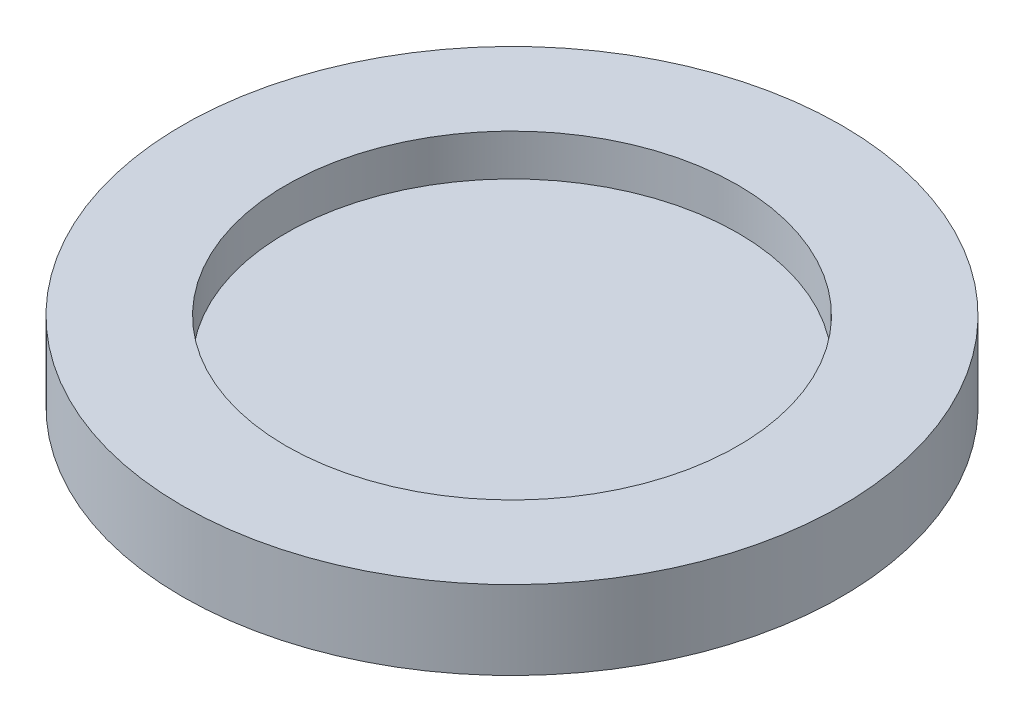
ISO-10303-21;
HEADER;
FILE_DESCRIPTION(('STEP AP214'),'2;1');
FILE_NAME('part.step','',(''),(''),'','','');
FILE_SCHEMA(('AUTOMOTIVE_DESIGN { 1 0 10303 214 1 1 1 1 }'));
ENDSEC;
DATA;
#1=APPLICATION_CONTEXT('core data for automotive mechanical design processes');
#2=APPLICATION_PROTOCOL_DEFINITION('international standard','automotive_design',2000,#1);
#3=PRODUCT_CONTEXT('',#1,'mechanical');
#4=PRODUCT('Part','Part','',(#3));
#5=PRODUCT_RELATED_PRODUCT_CATEGORY('part','',(#4));
#6=PRODUCT_DEFINITION_FORMATION('','',#4);
#7=PRODUCT_DEFINITION_CONTEXT('part definition',#1,'design');
#8=PRODUCT_DEFINITION('design','',#6,#7);
#9=PRODUCT_DEFINITION_SHAPE('','',#8);
#10=(LENGTH_UNIT() NAMED_UNIT(*) SI_UNIT(.MILLI.,.METRE.));
#11=(NAMED_UNIT(*) PLANE_ANGLE_UNIT() SI_UNIT($,.RADIAN.));
#12=(NAMED_UNIT(*) SI_UNIT($,.STERADIAN.) SOLID_ANGLE_UNIT());
#13=UNCERTAINTY_MEASURE_WITH_UNIT(LENGTH_MEASURE(1.E-05),#10,'distance_accuracy_value','');
#14=(GEOMETRIC_REPRESENTATION_CONTEXT(3) GLOBAL_UNCERTAINTY_ASSIGNED_CONTEXT((#13)) GLOBAL_UNIT_ASSIGNED_CONTEXT((#10,
#11,#12)) REPRESENTATION_CONTEXT('',''));
#15=CARTESIAN_POINT('',(0.,0.,0.));
#16=DIRECTION('',(0.,0.,1.));
#17=DIRECTION('',(1.,0.,0.));
#18=AXIS2_PLACEMENT_3D('',#15,#16,#17);
#19=CARTESIAN_POINT('',(0.,1.9,0.));
#20=DIRECTION('',(0.,1.,0.));
#21=DIRECTION('',(0.,0.,1.));
#22=AXIS2_PLACEMENT_3D('',#19,#20,#21);
#23=PLANE('',#22);
#24=CARTESIAN_POINT('',(0.,1.9,0.));
#25=DIRECTION('',(0.,1.,0.));
#26=DIRECTION('',(0.,0.,1.));
#27=AXIS2_PLACEMENT_3D('',#24,#25,#26);
#28=CIRCLE('',#27,7.95);
#29=CARTESIAN_POINT('',(0.,1.9,-7.95));
#30=VERTEX_POINT('',#29);
#31=EDGE_CURVE('E45',#30,#30,#28,.T.);
#32=ORIENTED_EDGE('',*,*,#31,.T.);
#33=EDGE_LOOP('',(#32));
#34=FACE_BOUND('',#33,.T.);
#35=CARTESIAN_POINT('',(0.,1.9,0.));
#36=DIRECTION('',(0.,1.,0.));
#37=DIRECTION('',(0.,0.,1.));
#38=AXIS2_PLACEMENT_3D('',#35,#36,#37);
#39=CIRCLE('',#38,5.45);
#40=CARTESIAN_POINT('',(0.,1.9,-5.45));
#41=VERTEX_POINT('',#40);
#42=EDGE_CURVE('E56',#41,#41,#39,.T.);
#43=ORIENTED_EDGE('',*,*,#42,.F.);
#44=EDGE_LOOP('',(#43));
#45=FACE_BOUND('',#44,.T.);
#46=ADVANCED_FACE('F37',(#34,#45),#23,.T.);
#47=CARTESIAN_POINT('',(0.,0.,0.));
#48=DIRECTION('',(0.,1.,0.));
#49=DIRECTION('',(0.,0.,1.));
#50=AXIS2_PLACEMENT_3D('',#47,#48,#49);
#51=PLANE('',#50);
#52=CARTESIAN_POINT('',(0.,0.,0.));
#53=DIRECTION('',(0.,1.,0.));
#54=DIRECTION('',(0.,0.,1.));
#55=AXIS2_PLACEMENT_3D('',#52,#53,#54);
#56=CIRCLE('',#55,7.95);
#57=CARTESIAN_POINT('',(0.,0.,-7.95));
#58=VERTEX_POINT('',#57);
#59=EDGE_CURVE('E50',#58,#58,#56,.T.);
#60=ORIENTED_EDGE('',*,*,#59,.F.);
#61=EDGE_LOOP('',(#60));
#62=FACE_BOUND('',#61,.T.);
#63=ADVANCED_FACE('F65',(#62),#51,.F.);
#64=CARTESIAN_POINT('',(0.,1.9,0.));
#65=DIRECTION('',(0.,-1.,0.));
#66=DIRECTION('',(0.,0.,-1.));
#67=AXIS2_PLACEMENT_3D('',#64,#65,#66);
#68=CYLINDRICAL_SURFACE('',#67,7.95);
#69=CARTESIAN_POINT('',(0.,1.9,-7.95));
#70=CARTESIAN_POINT('',(0.,1.88020833333333,-7.95));
#71=CARTESIAN_POINT('',(0.,1.86041666666667,-7.95));
#72=CARTESIAN_POINT('',(0.,1.82083333333333,-7.95));
#73=CARTESIAN_POINT('',(0.,1.80104166666667,-7.95));
#74=CARTESIAN_POINT('',(0.,1.76145833333333,-7.95));
#75=CARTESIAN_POINT('',(0.,1.74166666666667,-7.95));
#76=CARTESIAN_POINT('',(0.,1.70208333333333,-7.95));
#77=CARTESIAN_POINT('',(0.,1.68229166666667,-7.95));
#78=CARTESIAN_POINT('',(0.,1.64270833333333,-7.95));
#79=CARTESIAN_POINT('',(0.,1.62291666666667,-7.95));
#80=CARTESIAN_POINT('',(0.,1.58333333333333,-7.95));
#81=CARTESIAN_POINT('',(0.,1.56354166666667,-7.95));
#82=CARTESIAN_POINT('',(0.,1.52395833333333,-7.95));
#83=CARTESIAN_POINT('',(0.,1.50416666666667,-7.95));
#84=CARTESIAN_POINT('',(0.,1.46458333333333,-7.95));
#85=CARTESIAN_POINT('',(0.,1.44479166666667,-7.95));
#86=CARTESIAN_POINT('',(0.,1.40520833333333,-7.95));
#87=CARTESIAN_POINT('',(0.,1.38541666666667,-7.95));
#88=CARTESIAN_POINT('',(0.,1.34583333333333,-7.95));
#89=CARTESIAN_POINT('',(0.,1.32604166666667,-7.95));
#90=CARTESIAN_POINT('',(0.,1.28645833333333,-7.95));
#91=CARTESIAN_POINT('',(0.,1.26666666666667,-7.95));
#92=CARTESIAN_POINT('',(0.,1.22708333333333,-7.95));
#93=CARTESIAN_POINT('',(0.,1.20729166666667,-7.95));
#94=CARTESIAN_POINT('',(0.,1.16770833333333,-7.95));
#95=CARTESIAN_POINT('',(0.,1.14791666666667,-7.95));
#96=CARTESIAN_POINT('',(0.,1.10833333333333,-7.95));
#97=CARTESIAN_POINT('',(0.,1.08854166666667,-7.95));
#98=CARTESIAN_POINT('',(0.,1.04895833333333,-7.95));
#99=CARTESIAN_POINT('',(0.,1.02916666666667,-7.95));
#100=CARTESIAN_POINT('',(0.,0.989583333333333,-7.95));
#101=CARTESIAN_POINT('',(0.,0.969791666666666,-7.95));
#102=CARTESIAN_POINT('',(0.,0.930208333333333,-7.95));
#103=CARTESIAN_POINT('',(0.,0.910416666666667,-7.95));
#104=CARTESIAN_POINT('',(0.,0.870833333333333,-7.95));
#105=CARTESIAN_POINT('',(0.,0.851041666666667,-7.95));
#106=CARTESIAN_POINT('',(0.,0.811458333333333,-7.95));
#107=CARTESIAN_POINT('',(0.,0.791666666666667,-7.95));
#108=CARTESIAN_POINT('',(0.,0.752083333333333,-7.95));
#109=CARTESIAN_POINT('',(0.,0.732291666666667,-7.95));
#110=CARTESIAN_POINT('',(0.,0.692708333333333,-7.95));
#111=CARTESIAN_POINT('',(0.,0.672916666666667,-7.95));
#112=CARTESIAN_POINT('',(0.,0.633333333333333,-7.95));
#113=CARTESIAN_POINT('',(0.,0.613541666666667,-7.95));
#114=CARTESIAN_POINT('',(0.,0.573958333333333,-7.95));
#115=CARTESIAN_POINT('',(0.,0.554166666666667,-7.95));
#116=CARTESIAN_POINT('',(0.,0.514583333333334,-7.95));
#117=CARTESIAN_POINT('',(0.,0.494791666666667,-7.95));
#118=CARTESIAN_POINT('',(0.,0.455208333333333,-7.95));
#119=CARTESIAN_POINT('',(0.,0.435416666666667,-7.95));
#120=CARTESIAN_POINT('',(0.,0.395833333333333,-7.95));
#121=CARTESIAN_POINT('',(0.,0.376041666666667,-7.95));
#122=CARTESIAN_POINT('',(0.,0.336458333333333,-7.95));
#123=CARTESIAN_POINT('',(0.,0.316666666666667,-7.95));
#124=CARTESIAN_POINT('',(0.,0.277083333333333,-7.95));
#125=CARTESIAN_POINT('',(0.,0.257291666666667,-7.95));
#126=CARTESIAN_POINT('',(0.,0.217708333333333,-7.95));
#127=CARTESIAN_POINT('',(0.,0.197916666666667,-7.95));
#128=CARTESIAN_POINT('',(0.,0.158333333333333,-7.95));
#129=CARTESIAN_POINT('',(0.,0.138541666666667,-7.95));
#130=CARTESIAN_POINT('',(0.,0.0989583333333333,-7.95));
#131=CARTESIAN_POINT('',(0.,0.0791666666666666,-7.95));
#132=CARTESIAN_POINT('',(0.,0.0395833333333333,-7.95));
#133=CARTESIAN_POINT('',(0.,0.0197916666666666,-7.95));
#134=CARTESIAN_POINT('',(0.,0.,-7.95));
#135=B_SPLINE_CURVE_WITH_KNOTS('',3,(#69,#70,#71,#72,#73,#74,#75,#76,#77,#78,#79,#80,#81,#82,
#83,#84,#85,#86,#87,#88,#89,#90,#91,#92,#93,#94,#95,#96,#97,#98,#99,#100,#101,#102,#103,#104,
#105,#106,#107,#108,#109,#110,#111,#112,#113,#114,#115,#116,#117,#118,#119,#120,#121,#122,#123,
#124,#125,#126,#127,#128,#129,#130,#131,#132,#133,#134),.UNSPECIFIED.,.F.,.F.,(4,2,2,2,2,2,2,2,
2,2,2,2,2,2,2,2,2,2,2,2,2,2,2,2,2,2,2,2,2,2,2,2,4),(0.,0.0593750000000002,0.11875,0.178125,
0.2375,0.296875,0.35625,0.415625,0.475,0.534375,0.59375,0.653125,0.7125,0.771875,0.83125,
0.890625,0.95,1.009375,1.06875,1.128125,1.1875,1.246875,1.30625,1.365625,1.425,1.484375,1.54375,
1.603125,1.6625,1.721875,1.78125,1.840625,1.9),.UNSPECIFIED.);
#136=EDGE_CURVE('BSEAM39',#30,#58,#135,.T.);
#137=ORIENTED_EDGE('',*,*,#31,.F.);
#138=ORIENTED_EDGE('',*,*,#59,.T.);
#139=ORIENTED_EDGE('',*,*,#136,.T.);
#140=ORIENTED_EDGE('',*,*,#136,.F.);
#141=EDGE_LOOP('',(#137,#139,#138,#140));
#142=FACE_BOUND('',#141,.T.);
#143=ADVANCED_FACE('F39',(#142),#68,.T.);
#144=CARTESIAN_POINT('',(0.,1.9,0.));
#145=DIRECTION('',(0.,-1.,0.));
#146=DIRECTION('',(0.,0.,-1.));
#147=AXIS2_PLACEMENT_3D('',#144,#145,#146);
#148=CYLINDRICAL_SURFACE('',#147,5.45);
#149=CARTESIAN_POINT('',(0.,0.9,0.));
#150=DIRECTION('',(0.,1.,0.));
#151=DIRECTION('',(0.,0.,1.));
#152=AXIS2_PLACEMENT_3D('',#149,#150,#151);
#153=CIRCLE('',#152,5.45);
#154=CARTESIAN_POINT('',(0.,0.9,-5.45));
#155=VERTEX_POINT('',#154);
#156=EDGE_CURVE('E10',#155,#155,#153,.T.);
#157=CARTESIAN_POINT('',(0.,0.9,-5.45));
#158=CARTESIAN_POINT('',(0.,0.910416666666666,-5.45));
#159=CARTESIAN_POINT('',(0.,0.920833333333333,-5.45));
#160=CARTESIAN_POINT('',(0.,0.941666666666666,-5.45));
#161=CARTESIAN_POINT('',(0.,0.952083333333333,-5.45));
#162=CARTESIAN_POINT('',(0.,0.972916666666666,-5.45));
#163=CARTESIAN_POINT('',(0.,0.983333333333333,-5.45));
#164=CARTESIAN_POINT('',(0.,1.00416666666667,-5.45));
#165=CARTESIAN_POINT('',(0.,1.01458333333333,-5.45));
#166=CARTESIAN_POINT('',(0.,1.03541666666667,-5.45));
#167=CARTESIAN_POINT('',(0.,1.04583333333333,-5.45));
#168=CARTESIAN_POINT('',(0.,1.06666666666667,-5.45));
#169=CARTESIAN_POINT('',(0.,1.07708333333333,-5.45));
#170=CARTESIAN_POINT('',(0.,1.09791666666667,-5.45));
#171=CARTESIAN_POINT('',(0.,1.10833333333333,-5.45));
#172=CARTESIAN_POINT('',(0.,1.12916666666667,-5.45));
#173=CARTESIAN_POINT('',(0.,1.13958333333333,-5.45));
#174=CARTESIAN_POINT('',(0.,1.16041666666667,-5.45));
#175=CARTESIAN_POINT('',(0.,1.17083333333333,-5.45));
#176=CARTESIAN_POINT('',(0.,1.19166666666667,-5.45));
#177=CARTESIAN_POINT('',(0.,1.20208333333333,-5.45));
#178=CARTESIAN_POINT('',(0.,1.22291666666667,-5.45));
#179=CARTESIAN_POINT('',(0.,1.23333333333333,-5.45));
#180=CARTESIAN_POINT('',(0.,1.25416666666667,-5.45));
#181=CARTESIAN_POINT('',(0.,1.26458333333333,-5.45));
#182=CARTESIAN_POINT('',(0.,1.28541666666667,-5.45));
#183=CARTESIAN_POINT('',(0.,1.29583333333333,-5.45));
#184=CARTESIAN_POINT('',(0.,1.31666666666667,-5.45));
#185=CARTESIAN_POINT('',(0.,1.32708333333333,-5.45));
#186=CARTESIAN_POINT('',(0.,1.34791666666667,-5.45));
#187=CARTESIAN_POINT('',(0.,1.35833333333333,-5.45));
#188=CARTESIAN_POINT('',(0.,1.37916666666667,-5.45));
#189=CARTESIAN_POINT('',(0.,1.38958333333333,-5.45));
#190=CARTESIAN_POINT('',(0.,1.41041666666667,-5.45));
#191=CARTESIAN_POINT('',(0.,1.42083333333333,-5.45));
#192=CARTESIAN_POINT('',(0.,1.44166666666667,-5.45));
#193=CARTESIAN_POINT('',(0.,1.45208333333333,-5.45));
#194=CARTESIAN_POINT('',(0.,1.47291666666667,-5.45));
#195=CARTESIAN_POINT('',(0.,1.48333333333333,-5.45));
#196=CARTESIAN_POINT('',(0.,1.50416666666667,-5.45));
#197=CARTESIAN_POINT('',(0.,1.51458333333333,-5.45));
#198=CARTESIAN_POINT('',(0.,1.53541666666667,-5.45));
#199=CARTESIAN_POINT('',(0.,1.54583333333333,-5.45));
#200=CARTESIAN_POINT('',(0.,1.56666666666667,-5.45));
#201=CARTESIAN_POINT('',(0.,1.57708333333333,-5.45));
#202=CARTESIAN_POINT('',(0.,1.59791666666667,-5.45));
#203=CARTESIAN_POINT('',(0.,1.60833333333333,-5.45));
#204=CARTESIAN_POINT('',(0.,1.62916666666667,-5.45));
#205=CARTESIAN_POINT('',(0.,1.63958333333333,-5.45));
#206=CARTESIAN_POINT('',(0.,1.66041666666667,-5.45));
#207=CARTESIAN_POINT('',(0.,1.67083333333333,-5.45));
#208=CARTESIAN_POINT('',(0.,1.69166666666667,-5.45));
#209=CARTESIAN_POINT('',(0.,1.70208333333333,-5.45));
#210=CARTESIAN_POINT('',(0.,1.72291666666667,-5.45));
#211=CARTESIAN_POINT('',(0.,1.73333333333333,-5.45));
#212=CARTESIAN_POINT('',(0.,1.75416666666667,-5.45));
#213=CARTESIAN_POINT('',(0.,1.76458333333333,-5.45));
#214=CARTESIAN_POINT('',(0.,1.78541666666667,-5.45));
#215=CARTESIAN_POINT('',(0.,1.79583333333333,-5.45));
#216=CARTESIAN_POINT('',(0.,1.81666666666667,-5.45));
#217=CARTESIAN_POINT('',(0.,1.82708333333333,-5.45));
#218=CARTESIAN_POINT('',(0.,1.84791666666667,-5.45));
#219=CARTESIAN_POINT('',(0.,1.85833333333333,-5.45));
#220=CARTESIAN_POINT('',(0.,1.87916666666667,-5.45));
#221=CARTESIAN_POINT('',(0.,1.88958333333333,-5.45));
#222=CARTESIAN_POINT('',(0.,1.9,-5.45));
#223=B_SPLINE_CURVE_WITH_KNOTS('',3,(#157,#158,#159,#160,#161,#162,#163,#164,#165,#166,#167,
#168,#169,#170,#171,#172,#173,#174,#175,#176,#177,#178,#179,#180,#181,#182,#183,#184,#185,#186,
#187,#188,#189,#190,#191,#192,#193,#194,#195,#196,#197,#198,#199,#200,#201,#202,#203,#204,#205,
#206,#207,#208,#209,#210,#211,#212,#213,#214,#215,#216,#217,#218,#219,#220,#221,#222),
.UNSPECIFIED.,.F.,.F.,(4,2,2,2,2,2,2,2,2,2,2,2,2,2,2,2,2,2,2,2,2,2,2,2,2,2,2,2,2,2,2,2,4),(0.,
0.0312499999999999,0.0624999999999999,0.0937500000000001,0.125,0.15625,0.1875,0.21875,0.25,
0.28125,0.3125,0.34375,0.375,0.40625,0.4375,0.46875,0.5,0.53125,0.5625,0.59375,0.625,0.65625,
0.6875,0.71875,0.75,0.78125,0.8125,0.84375,0.875,0.90625,0.9375,0.96875,1.),.UNSPECIFIED.);
#224=EDGE_CURVE('BSEAM62',#155,#41,#223,.T.);
#225=ORIENTED_EDGE('',*,*,#156,.F.);
#226=ORIENTED_EDGE('',*,*,#42,.T.);
#227=ORIENTED_EDGE('',*,*,#224,.T.);
#228=ORIENTED_EDGE('',*,*,#224,.F.);
#229=EDGE_LOOP('',(#225,#227,#226,#228));
#230=FACE_BOUND('',#229,.T.);
#231=ADVANCED_FACE('F62',(#230),#148,.F.);
#232=CARTESIAN_POINT('',(0.,0.9,0.));
#233=DIRECTION('',(0.,1.,0.));
#234=DIRECTION('',(0.,0.,1.));
#235=AXIS2_PLACEMENT_3D('',#232,#233,#234);
#236=PLANE('',#235);
#237=ORIENTED_EDGE('',*,*,#156,.T.);
#238=EDGE_LOOP('',(#237));
#239=FACE_BOUND('',#238,.T.);
#240=ADVANCED_FACE('F74',(#239),#236,.T.);
#241=CLOSED_SHELL('',(#46,#63,#143,#231,#240));
#242=MANIFOLD_SOLID_BREP('B2',#241);
#243=ADVANCED_BREP_SHAPE_REPRESENTATION('',(#18,#242),#14);
#244=SHAPE_DEFINITION_REPRESENTATION(#9,#243);
ENDSEC;
END-ISO-10303-21;
